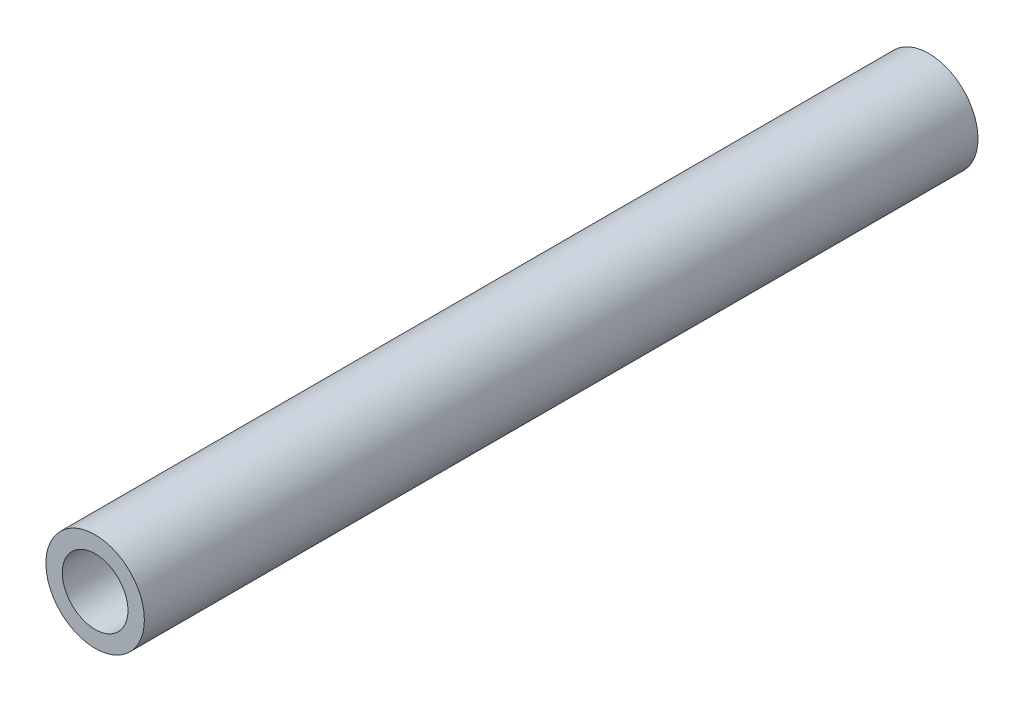
ISO-10303-21;
HEADER;
FILE_DESCRIPTION(('STEP AP214'),'2;1');
FILE_NAME('part.step','',(''),(''),'','','');
FILE_SCHEMA(('AUTOMOTIVE_DESIGN { 1 0 10303 214 1 1 1 1 }'));
ENDSEC;
DATA;
#1=APPLICATION_CONTEXT('core data for automotive mechanical design processes');
#2=APPLICATION_PROTOCOL_DEFINITION('international standard','automotive_design',2000,#1);
#3=PRODUCT_CONTEXT('',#1,'mechanical');
#4=PRODUCT('Part','Part','',(#3));
#5=PRODUCT_RELATED_PRODUCT_CATEGORY('part','',(#4));
#6=PRODUCT_DEFINITION_FORMATION('','',#4);
#7=PRODUCT_DEFINITION_CONTEXT('part definition',#1,'design');
#8=PRODUCT_DEFINITION('design','',#6,#7);
#9=PRODUCT_DEFINITION_SHAPE('','',#8);
#10=(LENGTH_UNIT() NAMED_UNIT(*) SI_UNIT(.MILLI.,.METRE.));
#11=(NAMED_UNIT(*) PLANE_ANGLE_UNIT() SI_UNIT($,.RADIAN.));
#12=(NAMED_UNIT(*) SI_UNIT($,.STERADIAN.) SOLID_ANGLE_UNIT());
#13=UNCERTAINTY_MEASURE_WITH_UNIT(LENGTH_MEASURE(1.E-05),#10,'distance_accuracy_value','');
#14=(GEOMETRIC_REPRESENTATION_CONTEXT(3) GLOBAL_UNCERTAINTY_ASSIGNED_CONTEXT((#13)) GLOBAL_UNIT_ASSIGNED_CONTEXT((#10,
#11,#12)) REPRESENTATION_CONTEXT('',''));
#15=CARTESIAN_POINT('',(0.,0.,0.));
#16=DIRECTION('',(0.,0.,1.));
#17=DIRECTION('',(1.,0.,0.));
#18=AXIS2_PLACEMENT_3D('',#15,#16,#17);
#19=CARTESIAN_POINT('',(0.,0.,50.8));
#20=DIRECTION('',(0.,0.,1.));
#21=DIRECTION('',(1.,0.,0.));
#22=AXIS2_PLACEMENT_3D('',#19,#20,#21);
#23=PLANE('',#22);
#24=CARTESIAN_POINT('',(0.,0.,50.8));
#25=DIRECTION('',(0.,0.,1.));
#26=DIRECTION('',(1.,0.,0.));
#27=AXIS2_PLACEMENT_3D('',#24,#25,#26);
#28=CIRCLE('',#27,3.);
#29=CARTESIAN_POINT('',(3.,0.,50.8));
#30=VERTEX_POINT('',#29);
#31=EDGE_CURVE('E10',#30,#30,#28,.T.);
#32=ORIENTED_EDGE('',*,*,#31,.T.);
#33=EDGE_LOOP('',(#32));
#34=FACE_BOUND('',#33,.T.);
#35=CARTESIAN_POINT('',(0.,0.,50.8));
#36=DIRECTION('',(0.,0.,1.));
#37=DIRECTION('',(1.,0.,0.));
#38=AXIS2_PLACEMENT_3D('',#35,#36,#37);
#39=CIRCLE('',#38,2.);
#40=CARTESIAN_POINT('',(2.,0.,50.8));
#41=VERTEX_POINT('',#40);
#42=EDGE_CURVE('E55',#41,#41,#39,.T.);
#43=ORIENTED_EDGE('',*,*,#42,.F.);
#44=EDGE_LOOP('',(#43));
#45=FACE_BOUND('',#44,.T.);
#46=ADVANCED_FACE('F40',(#34,#45),#23,.T.);
#47=CARTESIAN_POINT('',(0.,0.,0.));
#48=DIRECTION('',(0.,0.,1.));
#49=DIRECTION('',(1.,0.,0.));
#50=AXIS2_PLACEMENT_3D('',#47,#48,#49);
#51=PLANE('',#50);
#52=CARTESIAN_POINT('',(0.,0.,0.));
#53=DIRECTION('',(0.,0.,1.));
#54=DIRECTION('',(1.,0.,0.));
#55=AXIS2_PLACEMENT_3D('',#52,#53,#54);
#56=CIRCLE('',#55,3.);
#57=CARTESIAN_POINT('',(3.,0.,0.));
#58=VERTEX_POINT('',#57);
#59=EDGE_CURVE('E44',#58,#58,#56,.T.);
#60=ORIENTED_EDGE('',*,*,#59,.F.);
#61=EDGE_LOOP('',(#60));
#62=FACE_BOUND('',#61,.T.);
#63=CARTESIAN_POINT('',(0.,0.,0.));
#64=DIRECTION('',(0.,0.,1.));
#65=DIRECTION('',(1.,0.,0.));
#66=AXIS2_PLACEMENT_3D('',#63,#64,#65);
#67=CIRCLE('',#66,2.);
#68=CARTESIAN_POINT('',(2.,0.,0.));
#69=VERTEX_POINT('',#68);
#70=EDGE_CURVE('E57',#69,#69,#67,.T.);
#71=ORIENTED_EDGE('',*,*,#70,.T.);
#72=EDGE_LOOP('',(#71));
#73=FACE_BOUND('',#72,.T.);
#74=ADVANCED_FACE('F67',(#62,#73),#51,.F.);
#75=CARTESIAN_POINT('',(0.,0.,50.8));
#76=DIRECTION('',(0.,0.,-1.));
#77=DIRECTION('',(-1.,0.,0.));
#78=AXIS2_PLACEMENT_3D('',#75,#76,#77);
#79=CYLINDRICAL_SURFACE('',#78,3.);
#80=ORIENTED_EDGE('',*,*,#31,.F.);
#81=EDGE_LOOP('',(#80));
#82=FACE_BOUND('',#81,.T.);
#83=ORIENTED_EDGE('',*,*,#59,.T.);
#84=EDGE_LOOP('',(#83));
#85=FACE_BOUND('',#84,.T.);
#86=ADVANCED_FACE('F42',(#82,#85),#79,.T.);
#87=CARTESIAN_POINT('',(0.,0.,50.8));
#88=DIRECTION('',(0.,0.,-1.));
#89=DIRECTION('',(-1.,0.,0.));
#90=AXIS2_PLACEMENT_3D('',#87,#88,#89);
#91=CYLINDRICAL_SURFACE('',#90,2.);
#92=ORIENTED_EDGE('',*,*,#42,.T.);
#93=EDGE_LOOP('',(#92));
#94=FACE_BOUND('',#93,.T.);
#95=ORIENTED_EDGE('',*,*,#70,.F.);
#96=EDGE_LOOP('',(#95));
#97=FACE_BOUND('',#96,.T.);
#98=ADVANCED_FACE('F63',(#94,#97),#91,.F.);
#99=CLOSED_SHELL('',(#46,#74,#86,#98));
#100=MANIFOLD_SOLID_BREP('B2',#99);
#101=ADVANCED_BREP_SHAPE_REPRESENTATION('',(#18,#100),#14);
#102=SHAPE_DEFINITION_REPRESENTATION(#9,#101);
ENDSEC;
END-ISO-10303-21;
